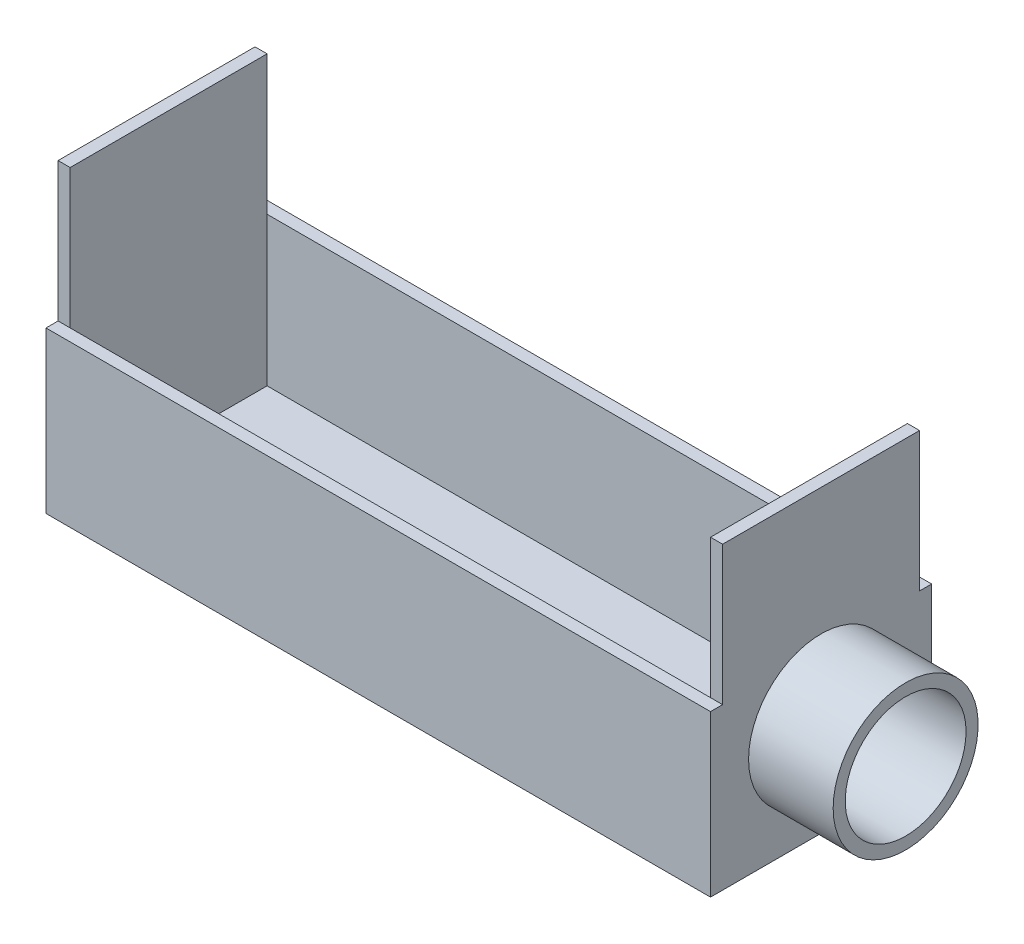
ISO-10303-21;
HEADER;
FILE_DESCRIPTION(('STEP AP214'),'2;1');
FILE_NAME('part.step','',(''),(''),'','','');
FILE_SCHEMA(('AUTOMOTIVE_DESIGN { 1 0 10303 214 1 1 1 1 }'));
ENDSEC;
DATA;
#1=APPLICATION_CONTEXT('core data for automotive mechanical design processes');
#2=APPLICATION_PROTOCOL_DEFINITION('international standard','automotive_design',2000,#1);
#3=PRODUCT_CONTEXT('',#1,'mechanical');
#4=PRODUCT('Part','Part','',(#3));
#5=PRODUCT_RELATED_PRODUCT_CATEGORY('part','',(#4));
#6=PRODUCT_DEFINITION_FORMATION('','',#4);
#7=PRODUCT_DEFINITION_CONTEXT('part definition',#1,'design');
#8=PRODUCT_DEFINITION('design','',#6,#7);
#9=PRODUCT_DEFINITION_SHAPE('','',#8);
#10=(LENGTH_UNIT() NAMED_UNIT(*) SI_UNIT(.MILLI.,.METRE.));
#11=(NAMED_UNIT(*) PLANE_ANGLE_UNIT() SI_UNIT($,.RADIAN.));
#12=(NAMED_UNIT(*) SI_UNIT($,.STERADIAN.) SOLID_ANGLE_UNIT());
#13=UNCERTAINTY_MEASURE_WITH_UNIT(LENGTH_MEASURE(1.E-05),#10,'distance_accuracy_value','');
#14=(GEOMETRIC_REPRESENTATION_CONTEXT(3) GLOBAL_UNCERTAINTY_ASSIGNED_CONTEXT((#13)) GLOBAL_UNIT_ASSIGNED_CONTEXT((#10,
#11,#12)) REPRESENTATION_CONTEXT('',''));
#15=CARTESIAN_POINT('',(0.,0.,0.));
#16=DIRECTION('',(0.,0.,1.));
#17=DIRECTION('',(1.,0.,0.));
#18=AXIS2_PLACEMENT_3D('',#15,#16,#17);
#19=CARTESIAN_POINT('',(12.3578643762691,-5.,0.));
#20=DIRECTION('',(1.,0.,0.));
#21=DIRECTION('',(0.,0.,-1.));
#22=AXIS2_PLACEMENT_3D('',#19,#20,#21);
#23=CYLINDRICAL_SURFACE('',#22,5.);
#24=CARTESIAN_POINT('',(34.5,-5.,0.));
#25=DIRECTION('',(1.,0.,0.));
#26=DIRECTION('',(0.,0.,-1.));
#27=AXIS2_PLACEMENT_3D('',#24,#25,#26);
#28=CIRCLE('',#27,5.);
#29=CARTESIAN_POINT('',(34.5,-5.,-5.));
#30=VERTEX_POINT('',#29);
#31=EDGE_CURVE('E155',#30,#30,#28,.F.);
#32=ORIENTED_EDGE('',*,*,#31,.F.);
#33=EDGE_LOOP('',(#32));
#34=FACE_BOUND('',#33,.T.);
#35=CARTESIAN_POINT('',(26.5,-5.,0.));
#36=DIRECTION('',(1.,0.,0.));
#37=DIRECTION('',(0.,0.,-1.));
#38=AXIS2_PLACEMENT_3D('',#35,#36,#37);
#39=CIRCLE('',#38,5.);
#40=CARTESIAN_POINT('',(26.5,-5.,-5.));
#41=VERTEX_POINT('',#40);
#42=EDGE_CURVE('E20',#41,#41,#39,.T.);
#43=ORIENTED_EDGE('',*,*,#42,.F.);
#44=EDGE_LOOP('',(#43));
#45=FACE_BOUND('',#44,.T.);
#46=ADVANCED_FACE('F17',(#34,#45),#23,.F.);
#47=CARTESIAN_POINT('',(-27.5,-12.3,9.15));
#48=DIRECTION('',(0.,1.,0.));
#49=DIRECTION('',(-1.,0.,0.));
#50=AXIS2_PLACEMENT_3D('',#47,#48,#49);
#51=PLANE('',#50);
#52=DIRECTION('',(1.,0.,0.));
#53=VECTOR('',#52,1.);
#54=CARTESIAN_POINT('',(-27.5,-12.3,8.15));
#55=LINE('',#54,#53);
#56=CARTESIAN_POINT('',(-26.5,-12.3,8.15));
#57=VERTEX_POINT('',#56);
#58=CARTESIAN_POINT('',(26.5,-12.3,8.15));
#59=VERTEX_POINT('',#58);
#60=EDGE_CURVE('E120',#57,#59,#55,.T.);
#61=ORIENTED_EDGE('',*,*,#60,.T.);
#62=DIRECTION('',(0.,0.,1.));
#63=VECTOR('',#62,1.);
#64=CARTESIAN_POINT('',(26.5,-12.3,9.15));
#65=LINE('',#64,#63);
#66=CARTESIAN_POINT('',(26.5,-12.3,-8.15));
#67=VERTEX_POINT('',#66);
#68=EDGE_CURVE('E115',#67,#59,#65,.T.);
#69=ORIENTED_EDGE('',*,*,#68,.F.);
#70=DIRECTION('',(1.,0.,0.));
#71=VECTOR('',#70,1.);
#72=CARTESIAN_POINT('',(-27.5,-12.3,-8.15));
#73=LINE('',#72,#71);
#74=CARTESIAN_POINT('',(-26.5,-12.3,-8.15));
#75=VERTEX_POINT('',#74);
#76=EDGE_CURVE('E133',#75,#67,#73,.T.);
#77=ORIENTED_EDGE('',*,*,#76,.F.);
#78=DIRECTION('',(0.,0.,1.));
#79=VECTOR('',#78,1.);
#80=CARTESIAN_POINT('',(-26.5,-12.3,9.15));
#81=LINE('',#80,#79);
#82=EDGE_CURVE('E129',#57,#75,#81,.F.);
#83=ORIENTED_EDGE('',*,*,#82,.F.);
#84=EDGE_LOOP('',(#61,#69,#77,#83));
#85=FACE_BOUND('',#84,.T.);
#86=ADVANCED_FACE('F132',(#85),#51,.T.);
#87=CARTESIAN_POINT('',(-26.5,0.,9.15));
#88=DIRECTION('',(1.,0.,0.));
#89=DIRECTION('',(0.,1.,0.));
#90=AXIS2_PLACEMENT_3D('',#87,#88,#89);
#91=PLANE('',#90);
#92=ORIENTED_EDGE('',*,*,#82,.T.);
#93=DIRECTION('',(0.,1.,0.));
#94=VECTOR('',#93,1.);
#95=CARTESIAN_POINT('',(-26.5,0.,-8.15));
#96=LINE('',#95,#94);
#97=CARTESIAN_POINT('',(-26.5,0.,-8.15));
#98=VERTEX_POINT('',#97);
#99=EDGE_CURVE('E157',#98,#75,#96,.F.);
#100=ORIENTED_EDGE('',*,*,#99,.F.);
#101=DIRECTION('',(0.,-1.,0.));
#102=VECTOR('',#101,1.);
#103=CARTESIAN_POINT('',(-26.5,11.5,-8.15));
#104=LINE('',#103,#102);
#105=CARTESIAN_POINT('',(-26.5,11.5,-8.15));
#106=VERTEX_POINT('',#105);
#107=EDGE_CURVE('E166',#98,#106,#104,.F.);
#108=ORIENTED_EDGE('',*,*,#107,.T.);
#109=DIRECTION('',(0.,0.,1.));
#110=VECTOR('',#109,1.);
#111=CARTESIAN_POINT('',(-26.5,11.5,9.15));
#112=LINE('',#111,#110);
#113=CARTESIAN_POINT('',(-26.5,11.5,8.15));
#114=VERTEX_POINT('',#113);
#115=EDGE_CURVE('E173',#114,#106,#112,.F.);
#116=ORIENTED_EDGE('',*,*,#115,.F.);
#117=DIRECTION('',(0.,1.,0.));
#118=VECTOR('',#117,1.);
#119=CARTESIAN_POINT('',(-26.5,11.5,8.15));
#120=LINE('',#119,#118);
#121=CARTESIAN_POINT('',(-26.5,0.,8.15));
#122=VERTEX_POINT('',#121);
#123=EDGE_CURVE('E140',#114,#122,#120,.F.);
#124=ORIENTED_EDGE('',*,*,#123,.T.);
#125=DIRECTION('',(0.,1.,0.));
#126=VECTOR('',#125,1.);
#127=CARTESIAN_POINT('',(-26.5,0.,8.15));
#128=LINE('',#127,#126);
#129=EDGE_CURVE('E125',#122,#57,#128,.F.);
#130=ORIENTED_EDGE('',*,*,#129,.T.);
#131=EDGE_LOOP('',(#92,#100,#108,#116,#124,#130));
#132=FACE_BOUND('',#131,.T.);
#133=ADVANCED_FACE('F138',(#132),#91,.T.);
#134=CARTESIAN_POINT('',(-27.5,0.,8.15));
#135=DIRECTION('',(0.,0.,1.));
#136=DIRECTION('',(1.,0.,0.));
#137=AXIS2_PLACEMENT_3D('',#134,#135,#136);
#138=PLANE('',#137);
#139=DIRECTION('',(1.,0.,0.));
#140=VECTOR('',#139,1.);
#141=CARTESIAN_POINT('',(-27.5,0.,8.15));
#142=LINE('',#141,#140);
#143=CARTESIAN_POINT('',(26.5,0.,8.15));
#144=VERTEX_POINT('',#143);
#145=EDGE_CURVE('E179',#122,#144,#142,.T.);
#146=ORIENTED_EDGE('',*,*,#145,.T.);
#147=DIRECTION('',(0.,1.,0.));
#148=VECTOR('',#147,1.);
#149=CARTESIAN_POINT('',(26.5,0.,8.15));
#150=LINE('',#149,#148);
#151=EDGE_CURVE('E127',#59,#144,#150,.T.);
#152=ORIENTED_EDGE('',*,*,#151,.F.);
#153=ORIENTED_EDGE('',*,*,#60,.F.);
#154=ORIENTED_EDGE('',*,*,#129,.F.);
#155=EDGE_LOOP('',(#146,#152,#153,#154));
#156=FACE_BOUND('',#155,.T.);
#157=ADVANCED_FACE('F123',(#156),#138,.F.);
#158=CARTESIAN_POINT('',(26.5,0.,9.15));
#159=DIRECTION('',(-1.,0.,0.));
#160=DIRECTION('',(0.,0.,1.));
#161=AXIS2_PLACEMENT_3D('',#158,#159,#160);
#162=PLANE('',#161);
#163=DIRECTION('',(0.,1.,0.));
#164=VECTOR('',#163,1.);
#165=CARTESIAN_POINT('',(26.5,11.5,8.15));
#166=LINE('',#165,#164);
#167=CARTESIAN_POINT('',(26.5,11.5,8.15));
#168=VERTEX_POINT('',#167);
#169=EDGE_CURVE('E186',#144,#168,#166,.T.);
#170=ORIENTED_EDGE('',*,*,#169,.T.);
#171=DIRECTION('',(0.,0.,1.));
#172=VECTOR('',#171,1.);
#173=CARTESIAN_POINT('',(26.5,11.5,9.15));
#174=LINE('',#173,#172);
#175=CARTESIAN_POINT('',(26.5,11.5,-8.15));
#176=VERTEX_POINT('',#175);
#177=EDGE_CURVE('E191',#168,#176,#174,.F.);
#178=ORIENTED_EDGE('',*,*,#177,.T.);
#179=DIRECTION('',(0.,-1.,0.));
#180=VECTOR('',#179,1.);
#181=CARTESIAN_POINT('',(26.5,11.5,-8.15));
#182=LINE('',#181,#180);
#183=CARTESIAN_POINT('',(26.5,0.,-8.15));
#184=VERTEX_POINT('',#183);
#185=EDGE_CURVE('E154',#176,#184,#182,.T.);
#186=ORIENTED_EDGE('',*,*,#185,.T.);
#187=DIRECTION('',(0.,1.,0.));
#188=VECTOR('',#187,1.);
#189=CARTESIAN_POINT('',(26.5,0.,-8.15));
#190=LINE('',#189,#188);
#191=EDGE_CURVE('E163',#67,#184,#190,.T.);
#192=ORIENTED_EDGE('',*,*,#191,.F.);
#193=ORIENTED_EDGE('',*,*,#68,.T.);
#194=ORIENTED_EDGE('',*,*,#151,.T.);
#195=EDGE_LOOP('',(#170,#178,#186,#192,#193,#194));
#196=FACE_BOUND('',#195,.T.);
#197=ORIENTED_EDGE('',*,*,#42,.T.);
#198=EDGE_LOOP('',(#197));
#199=FACE_BOUND('',#198,.T.);
#200=ADVANCED_FACE('F327',(#196,#199),#162,.T.);
#201=CARTESIAN_POINT('',(34.5,-5.,0.));
#202=DIRECTION('',(1.,0.,0.));
#203=DIRECTION('',(0.,0.,-1.));
#204=AXIS2_PLACEMENT_3D('',#201,#202,#203);
#205=PLANE('',#204);
#206=CARTESIAN_POINT('',(34.5,-5.,0.));
#207=DIRECTION('',(-1.,0.,0.));
#208=DIRECTION('',(0.,0.,1.));
#209=AXIS2_PLACEMENT_3D('',#206,#207,#208);
#210=CIRCLE('',#209,6.);
#211=CARTESIAN_POINT('',(34.5,-5.,6.));
#212=VERTEX_POINT('',#211);
#213=EDGE_CURVE('E151',#212,#212,#210,.T.);
#214=ORIENTED_EDGE('',*,*,#213,.F.);
#215=EDGE_LOOP('',(#214));
#216=FACE_BOUND('',#215,.T.);
#217=ORIENTED_EDGE('',*,*,#31,.T.);
#218=EDGE_LOOP('',(#217));
#219=FACE_BOUND('',#218,.T.);
#220=ADVANCED_FACE('F323',(#216,#219),#205,.T.);
#221=CARTESIAN_POINT('',(-27.5,0.,-8.15));
#222=DIRECTION('',(0.,0.,1.));
#223=DIRECTION('',(1.,0.,0.));
#224=AXIS2_PLACEMENT_3D('',#221,#222,#223);
#225=PLANE('',#224);
#226=ORIENTED_EDGE('',*,*,#191,.T.);
#227=DIRECTION('',(1.,0.,0.));
#228=VECTOR('',#227,1.);
#229=CARTESIAN_POINT('',(-27.5,0.,-8.15));
#230=LINE('',#229,#228);
#231=EDGE_CURVE('E202',#184,#98,#230,.F.);
#232=ORIENTED_EDGE('',*,*,#231,.T.);
#233=ORIENTED_EDGE('',*,*,#99,.T.);
#234=ORIENTED_EDGE('',*,*,#76,.T.);
#235=EDGE_LOOP('',(#226,#232,#233,#234));
#236=FACE_BOUND('',#235,.T.);
#237=ADVANCED_FACE('F319',(#236),#225,.T.);
#238=CARTESIAN_POINT('',(27.5,11.5,8.15));
#239=DIRECTION('',(0.,0.,-1.));
#240=DIRECTION('',(0.,1.,0.));
#241=AXIS2_PLACEMENT_3D('',#238,#239,#240);
#242=PLANE('',#241);
#243=DIRECTION('',(-1.,0.,0.));
#244=VECTOR('',#243,1.);
#245=CARTESIAN_POINT('',(-27.5,11.5,8.15));
#246=LINE('',#245,#244);
#247=CARTESIAN_POINT('',(-27.5,11.5,8.15));
#248=VERTEX_POINT('',#247);
#249=EDGE_CURVE('E170',#248,#114,#246,.F.);
#250=ORIENTED_EDGE('',*,*,#249,.F.);
#251=DIRECTION('',(0.,1.,0.));
#252=VECTOR('',#251,1.);
#253=CARTESIAN_POINT('',(-27.5,0.,8.15));
#254=LINE('',#253,#252);
#255=CARTESIAN_POINT('',(-27.5,0.,8.15));
#256=VERTEX_POINT('',#255);
#257=EDGE_CURVE('E205',#248,#256,#254,.F.);
#258=ORIENTED_EDGE('',*,*,#257,.T.);
#259=DIRECTION('',(1.,0.,0.));
#260=VECTOR('',#259,1.);
#261=CARTESIAN_POINT('',(-27.5,0.,8.15));
#262=LINE('',#261,#260);
#263=EDGE_CURVE('E176',#256,#122,#262,.T.);
#264=ORIENTED_EDGE('',*,*,#263,.T.);
#265=ORIENTED_EDGE('',*,*,#123,.F.);
#266=EDGE_LOOP('',(#250,#258,#264,#265));
#267=FACE_BOUND('',#266,.T.);
#268=ADVANCED_FACE('F315',(#267),#242,.F.);
#269=CARTESIAN_POINT('',(27.5,11.5,-8.15));
#270=DIRECTION('',(0.,0.,1.));
#271=DIRECTION('',(0.,-1.,0.));
#272=AXIS2_PLACEMENT_3D('',#269,#270,#271);
#273=PLANE('',#272);
#274=DIRECTION('',(1.,0.,0.));
#275=VECTOR('',#274,1.);
#276=CARTESIAN_POINT('',(-27.5,0.,-8.15));
#277=LINE('',#276,#275);
#278=CARTESIAN_POINT('',(-27.5,0.,-8.15));
#279=VERTEX_POINT('',#278);
#280=EDGE_CURVE('E153',#98,#279,#277,.F.);
#281=ORIENTED_EDGE('',*,*,#280,.T.);
#282=DIRECTION('',(0.,1.,0.));
#283=VECTOR('',#282,1.);
#284=CARTESIAN_POINT('',(-27.5,0.,-8.15));
#285=LINE('',#284,#283);
#286=CARTESIAN_POINT('',(-27.5,11.5,-8.15));
#287=VERTEX_POINT('',#286);
#288=EDGE_CURVE('E214',#279,#287,#285,.T.);
#289=ORIENTED_EDGE('',*,*,#288,.T.);
#290=DIRECTION('',(-1.,0.,0.));
#291=VECTOR('',#290,1.);
#292=CARTESIAN_POINT('',(-27.5,11.5,-8.15));
#293=LINE('',#292,#291);
#294=EDGE_CURVE('E168',#106,#287,#293,.T.);
#295=ORIENTED_EDGE('',*,*,#294,.F.);
#296=ORIENTED_EDGE('',*,*,#107,.F.);
#297=EDGE_LOOP('',(#281,#289,#295,#296));
#298=FACE_BOUND('',#297,.T.);
#299=ADVANCED_FACE('F311',(#298),#273,.F.);
#300=CARTESIAN_POINT('',(-27.5,11.5,9.15));
#301=DIRECTION('',(0.,1.,0.));
#302=DIRECTION('',(-1.,0.,0.));
#303=AXIS2_PLACEMENT_3D('',#300,#301,#302);
#304=PLANE('',#303);
#305=ORIENTED_EDGE('',*,*,#249,.T.);
#306=ORIENTED_EDGE('',*,*,#115,.T.);
#307=ORIENTED_EDGE('',*,*,#294,.T.);
#308=DIRECTION('',(0.,0.,1.));
#309=VECTOR('',#308,1.);
#310=CARTESIAN_POINT('',(-27.5,11.5,9.15));
#311=LINE('',#310,#309);
#312=EDGE_CURVE('E217',#287,#248,#311,.T.);
#313=ORIENTED_EDGE('',*,*,#312,.T.);
#314=EDGE_LOOP('',(#305,#306,#307,#313));
#315=FACE_BOUND('',#314,.T.);
#316=ADVANCED_FACE('F307',(#315),#304,.T.);
#317=CARTESIAN_POINT('',(-27.5,0.,9.15));
#318=DIRECTION('',(0.,-1.,0.));
#319=DIRECTION('',(1.,0.,0.));
#320=AXIS2_PLACEMENT_3D('',#317,#318,#319);
#321=PLANE('',#320);
#322=DIRECTION('',(0.,0.,1.));
#323=VECTOR('',#322,1.);
#324=CARTESIAN_POINT('',(27.5,0.,9.15));
#325=LINE('',#324,#323);
#326=CARTESIAN_POINT('',(27.5,0.,8.15));
#327=VERTEX_POINT('',#326);
#328=CARTESIAN_POINT('',(27.5,0.,9.15));
#329=VERTEX_POINT('',#328);
#330=EDGE_CURVE('E181',#327,#329,#325,.T.);
#331=ORIENTED_EDGE('',*,*,#330,.F.);
#332=DIRECTION('',(1.,0.,0.));
#333=VECTOR('',#332,1.);
#334=CARTESIAN_POINT('',(27.5,0.,8.15));
#335=LINE('',#334,#333);
#336=EDGE_CURVE('E183',#327,#144,#335,.F.);
#337=ORIENTED_EDGE('',*,*,#336,.T.);
#338=ORIENTED_EDGE('',*,*,#145,.F.);
#339=ORIENTED_EDGE('',*,*,#263,.F.);
#340=DIRECTION('',(0.,0.,1.));
#341=VECTOR('',#340,1.);
#342=CARTESIAN_POINT('',(-27.5,0.,9.15));
#343=LINE('',#342,#341);
#344=CARTESIAN_POINT('',(-27.5,0.,9.15));
#345=VERTEX_POINT('',#344);
#346=EDGE_CURVE('E208',#256,#345,#343,.T.);
#347=ORIENTED_EDGE('',*,*,#346,.T.);
#348=DIRECTION('',(1.,0.,0.));
#349=VECTOR('',#348,1.);
#350=CARTESIAN_POINT('',(-27.5,0.,9.15));
#351=LINE('',#350,#349);
#352=EDGE_CURVE('E220',#329,#345,#351,.F.);
#353=ORIENTED_EDGE('',*,*,#352,.F.);
#354=EDGE_LOOP('',(#331,#337,#338,#339,#347,#353));
#355=FACE_BOUND('',#354,.T.);
#356=ADVANCED_FACE('F303',(#355),#321,.F.);
#357=CARTESIAN_POINT('',(27.5,11.5,8.15));
#358=DIRECTION('',(0.,0.,-1.));
#359=DIRECTION('',(0.,1.,0.));
#360=AXIS2_PLACEMENT_3D('',#357,#358,#359);
#361=PLANE('',#360);
#362=ORIENTED_EDGE('',*,*,#336,.F.);
#363=DIRECTION('',(0.,1.,0.));
#364=VECTOR('',#363,1.);
#365=CARTESIAN_POINT('',(27.5,0.,8.15));
#366=LINE('',#365,#364);
#367=CARTESIAN_POINT('',(27.5,11.5,8.15));
#368=VERTEX_POINT('',#367);
#369=EDGE_CURVE('E227',#327,#368,#366,.T.);
#370=ORIENTED_EDGE('',*,*,#369,.T.);
#371=DIRECTION('',(1.,0.,0.));
#372=VECTOR('',#371,1.);
#373=CARTESIAN_POINT('',(27.5,11.5,8.15));
#374=LINE('',#373,#372);
#375=EDGE_CURVE('E188',#368,#168,#374,.F.);
#376=ORIENTED_EDGE('',*,*,#375,.T.);
#377=ORIENTED_EDGE('',*,*,#169,.F.);
#378=EDGE_LOOP('',(#362,#370,#376,#377));
#379=FACE_BOUND('',#378,.T.);
#380=ADVANCED_FACE('F299',(#379),#361,.F.);
#381=CARTESIAN_POINT('',(27.5,11.5,9.15));
#382=DIRECTION('',(0.,-1.,0.));
#383=DIRECTION('',(1.,0.,0.));
#384=AXIS2_PLACEMENT_3D('',#381,#382,#383);
#385=PLANE('',#384);
#386=DIRECTION('',(1.,0.,0.));
#387=VECTOR('',#386,1.);
#388=CARTESIAN_POINT('',(27.5,11.5,-8.15));
#389=LINE('',#388,#387);
#390=CARTESIAN_POINT('',(27.5,11.5,-8.15));
#391=VERTEX_POINT('',#390);
#392=EDGE_CURVE('E193',#391,#176,#389,.F.);
#393=ORIENTED_EDGE('',*,*,#392,.T.);
#394=ORIENTED_EDGE('',*,*,#177,.F.);
#395=ORIENTED_EDGE('',*,*,#375,.F.);
#396=DIRECTION('',(0.,0.,1.));
#397=VECTOR('',#396,1.);
#398=CARTESIAN_POINT('',(27.5,11.5,9.15));
#399=LINE('',#398,#397);
#400=EDGE_CURVE('E230',#368,#391,#399,.F.);
#401=ORIENTED_EDGE('',*,*,#400,.T.);
#402=EDGE_LOOP('',(#393,#394,#395,#401));
#403=FACE_BOUND('',#402,.T.);
#404=ADVANCED_FACE('F295',(#403),#385,.F.);
#405=CARTESIAN_POINT('',(27.5,11.5,-8.15));
#406=DIRECTION('',(0.,0.,1.));
#407=DIRECTION('',(0.,-1.,0.));
#408=AXIS2_PLACEMENT_3D('',#405,#406,#407);
#409=PLANE('',#408);
#410=ORIENTED_EDGE('',*,*,#392,.F.);
#411=DIRECTION('',(0.,1.,0.));
#412=VECTOR('',#411,1.);
#413=CARTESIAN_POINT('',(27.5,0.,-8.15));
#414=LINE('',#413,#412);
#415=CARTESIAN_POINT('',(27.5,0.,-8.15));
#416=VERTEX_POINT('',#415);
#417=EDGE_CURVE('E233',#391,#416,#414,.F.);
#418=ORIENTED_EDGE('',*,*,#417,.T.);
#419=DIRECTION('',(1.,0.,0.));
#420=VECTOR('',#419,1.);
#421=CARTESIAN_POINT('',(-27.5,0.,-8.15));
#422=LINE('',#421,#420);
#423=EDGE_CURVE('E199',#416,#184,#422,.F.);
#424=ORIENTED_EDGE('',*,*,#423,.T.);
#425=ORIENTED_EDGE('',*,*,#185,.F.);
#426=EDGE_LOOP('',(#410,#418,#424,#425));
#427=FACE_BOUND('',#426,.T.);
#428=ADVANCED_FACE('F291',(#427),#409,.F.);
#429=CARTESIAN_POINT('',(34.5,-5.,0.));
#430=DIRECTION('',(-1.,0.,0.));
#431=DIRECTION('',(0.,0.,1.));
#432=AXIS2_PLACEMENT_3D('',#429,#430,#431);
#433=CYLINDRICAL_SURFACE('',#432,6.);
#434=ORIENTED_EDGE('',*,*,#213,.T.);
#435=EDGE_LOOP('',(#434));
#436=FACE_BOUND('',#435,.T.);
#437=CARTESIAN_POINT('',(27.5,-5.,0.));
#438=DIRECTION('',(-1.,0.,0.));
#439=DIRECTION('',(0.,0.,1.));
#440=AXIS2_PLACEMENT_3D('',#437,#438,#439);
#441=CIRCLE('',#440,6.);
#442=CARTESIAN_POINT('',(27.5,-5.,6.));
#443=VERTEX_POINT('',#442);
#444=EDGE_CURVE('E147',#443,#443,#441,.F.);
#445=ORIENTED_EDGE('',*,*,#444,.T.);
#446=EDGE_LOOP('',(#445));
#447=FACE_BOUND('',#446,.T.);
#448=ADVANCED_FACE('F287',(#436,#447),#433,.T.);
#449=CARTESIAN_POINT('',(-27.5,0.,9.15));
#450=DIRECTION('',(0.,-1.,0.));
#451=DIRECTION('',(1.,0.,0.));
#452=AXIS2_PLACEMENT_3D('',#449,#450,#451);
#453=PLANE('',#452);
#454=ORIENTED_EDGE('',*,*,#423,.F.);
#455=DIRECTION('',(0.,0.,1.));
#456=VECTOR('',#455,1.);
#457=CARTESIAN_POINT('',(27.5,0.,9.15));
#458=LINE('',#457,#456);
#459=CARTESIAN_POINT('',(27.5,0.,-9.15));
#460=VERTEX_POINT('',#459);
#461=EDGE_CURVE('E150',#416,#460,#458,.F.);
#462=ORIENTED_EDGE('',*,*,#461,.T.);
#463=DIRECTION('',(1.,0.,0.));
#464=VECTOR('',#463,1.);
#465=CARTESIAN_POINT('',(-27.5,0.,-9.15));
#466=LINE('',#465,#464);
#467=CARTESIAN_POINT('',(-27.5,0.,-9.15));
#468=VERTEX_POINT('',#467);
#469=EDGE_CURVE('E238',#460,#468,#466,.F.);
#470=ORIENTED_EDGE('',*,*,#469,.T.);
#471=DIRECTION('',(0.,0.,1.));
#472=VECTOR('',#471,1.);
#473=CARTESIAN_POINT('',(-27.5,0.,9.15));
#474=LINE('',#473,#472);
#475=EDGE_CURVE('E211',#468,#279,#474,.T.);
#476=ORIENTED_EDGE('',*,*,#475,.T.);
#477=ORIENTED_EDGE('',*,*,#280,.F.);
#478=ORIENTED_EDGE('',*,*,#231,.F.);
#479=EDGE_LOOP('',(#454,#462,#470,#476,#477,#478));
#480=FACE_BOUND('',#479,.T.);
#481=ADVANCED_FACE('F284',(#480),#453,.F.);
#482=CARTESIAN_POINT('',(-27.5,0.,9.15));
#483=DIRECTION('',(1.,0.,0.));
#484=DIRECTION('',(0.,1.,0.));
#485=AXIS2_PLACEMENT_3D('',#482,#483,#484);
#486=PLANE('',#485);
#487=ORIENTED_EDGE('',*,*,#288,.F.);
#488=ORIENTED_EDGE('',*,*,#475,.F.);
#489=DIRECTION('',(0.,1.,0.));
#490=VECTOR('',#489,1.);
#491=CARTESIAN_POINT('',(-27.5,0.,-9.15));
#492=LINE('',#491,#490);
#493=CARTESIAN_POINT('',(-27.5,-13.3,-9.15));
#494=VERTEX_POINT('',#493);
#495=EDGE_CURVE('E241',#468,#494,#492,.F.);
#496=ORIENTED_EDGE('',*,*,#495,.T.);
#497=DIRECTION('',(0.,0.,1.));
#498=VECTOR('',#497,1.);
#499=CARTESIAN_POINT('',(-27.5,-13.3,9.15));
#500=LINE('',#499,#498);
#501=CARTESIAN_POINT('',(-27.5,-13.3,9.15));
#502=VERTEX_POINT('',#501);
#503=EDGE_CURVE('E244',#494,#502,#500,.T.);
#504=ORIENTED_EDGE('',*,*,#503,.T.);
#505=DIRECTION('',(0.,1.,0.));
#506=VECTOR('',#505,1.);
#507=CARTESIAN_POINT('',(-27.5,0.,9.15));
#508=LINE('',#507,#506);
#509=EDGE_CURVE('E222',#345,#502,#508,.F.);
#510=ORIENTED_EDGE('',*,*,#509,.F.);
#511=ORIENTED_EDGE('',*,*,#346,.F.);
#512=ORIENTED_EDGE('',*,*,#257,.F.);
#513=ORIENTED_EDGE('',*,*,#312,.F.);
#514=EDGE_LOOP('',(#487,#488,#496,#504,#510,#511,#512,#513));
#515=FACE_BOUND('',#514,.T.);
#516=ADVANCED_FACE('F266',(#515),#486,.F.);
#517=CARTESIAN_POINT('',(-27.5,0.,9.15));
#518=DIRECTION('',(0.,0.,1.));
#519=DIRECTION('',(1.,0.,0.));
#520=AXIS2_PLACEMENT_3D('',#517,#518,#519);
#521=PLANE('',#520);
#522=DIRECTION('',(-1.,0.,0.));
#523=VECTOR('',#522,1.);
#524=CARTESIAN_POINT('',(-27.5,-13.3,9.15));
#525=LINE('',#524,#523);
#526=CARTESIAN_POINT('',(27.5,-13.3,9.15));
#527=VERTEX_POINT('',#526);
#528=EDGE_CURVE('E247',#502,#527,#525,.F.);
#529=ORIENTED_EDGE('',*,*,#528,.T.);
#530=DIRECTION('',(0.,1.,0.));
#531=VECTOR('',#530,1.);
#532=CARTESIAN_POINT('',(27.5,0.,9.15));
#533=LINE('',#532,#531);
#534=EDGE_CURVE('E224',#527,#329,#533,.T.);
#535=ORIENTED_EDGE('',*,*,#534,.T.);
#536=ORIENTED_EDGE('',*,*,#352,.T.);
#537=ORIENTED_EDGE('',*,*,#509,.T.);
#538=EDGE_LOOP('',(#529,#535,#536,#537));
#539=FACE_BOUND('',#538,.T.);
#540=ADVANCED_FACE('F260',(#539),#521,.T.);
#541=CARTESIAN_POINT('',(27.5,0.,9.15));
#542=DIRECTION('',(-1.,0.,0.));
#543=DIRECTION('',(0.,0.,1.));
#544=AXIS2_PLACEMENT_3D('',#541,#542,#543);
#545=PLANE('',#544);
#546=ORIENTED_EDGE('',*,*,#444,.F.);
#547=EDGE_LOOP('',(#546));
#548=FACE_BOUND('',#547,.T.);
#549=ORIENTED_EDGE('',*,*,#417,.F.);
#550=ORIENTED_EDGE('',*,*,#400,.F.);
#551=ORIENTED_EDGE('',*,*,#369,.F.);
#552=ORIENTED_EDGE('',*,*,#330,.T.);
#553=ORIENTED_EDGE('',*,*,#534,.F.);
#554=DIRECTION('',(0.,0.,1.));
#555=VECTOR('',#554,1.);
#556=CARTESIAN_POINT('',(27.5,-13.3,9.15));
#557=LINE('',#556,#555);
#558=CARTESIAN_POINT('',(27.5,-13.3,-9.15));
#559=VERTEX_POINT('',#558);
#560=EDGE_CURVE('E26',#527,#559,#557,.F.);
#561=ORIENTED_EDGE('',*,*,#560,.T.);
#562=DIRECTION('',(0.,1.,0.));
#563=VECTOR('',#562,1.);
#564=CARTESIAN_POINT('',(27.5,0.,-9.15));
#565=LINE('',#564,#563);
#566=EDGE_CURVE('E34',#559,#460,#565,.T.);
#567=ORIENTED_EDGE('',*,*,#566,.T.);
#568=ORIENTED_EDGE('',*,*,#461,.F.);
#569=EDGE_LOOP('',(#549,#550,#551,#552,#553,#561,#567,#568));
#570=FACE_BOUND('',#569,.T.);
#571=ADVANCED_FACE('F254',(#548,#570),#545,.F.);
#572=CARTESIAN_POINT('',(-27.5,0.,-9.15));
#573=DIRECTION('',(0.,0.,1.));
#574=DIRECTION('',(1.,0.,0.));
#575=AXIS2_PLACEMENT_3D('',#572,#573,#574);
#576=PLANE('',#575);
#577=ORIENTED_EDGE('',*,*,#469,.F.);
#578=ORIENTED_EDGE('',*,*,#566,.F.);
#579=DIRECTION('',(-1.,0.,0.));
#580=VECTOR('',#579,1.);
#581=CARTESIAN_POINT('',(-27.5,-13.3,-9.15));
#582=LINE('',#581,#580);
#583=EDGE_CURVE('E11',#559,#494,#582,.T.);
#584=ORIENTED_EDGE('',*,*,#583,.T.);
#585=ORIENTED_EDGE('',*,*,#495,.F.);
#586=EDGE_LOOP('',(#577,#578,#584,#585));
#587=FACE_BOUND('',#586,.T.);
#588=ADVANCED_FACE('F268',(#587),#576,.F.);
#589=CARTESIAN_POINT('',(-27.5,-13.3,9.15));
#590=DIRECTION('',(0.,1.,0.));
#591=DIRECTION('',(-1.,0.,0.));
#592=AXIS2_PLACEMENT_3D('',#589,#590,#591);
#593=PLANE('',#592);
#594=ORIENTED_EDGE('',*,*,#560,.F.);
#595=ORIENTED_EDGE('',*,*,#528,.F.);
#596=ORIENTED_EDGE('',*,*,#503,.F.);
#597=ORIENTED_EDGE('',*,*,#583,.F.);
#598=EDGE_LOOP('',(#594,#595,#596,#597));
#599=FACE_BOUND('',#598,.T.);
#600=ADVANCED_FACE('F258',(#599),#593,.F.);
#601=CLOSED_SHELL('',(#46,#86,#133,#157,#200,#220,#237,#268,#299,#316,#356,#380,#404,#428,#448,
#481,#516,#540,#571,#588,#600));
#602=MANIFOLD_SOLID_BREP('B1',#601);
#603=ADVANCED_BREP_SHAPE_REPRESENTATION('',(#18,#602),#14);
#604=SHAPE_DEFINITION_REPRESENTATION(#9,#603);
ENDSEC;
END-ISO-10303-21;
